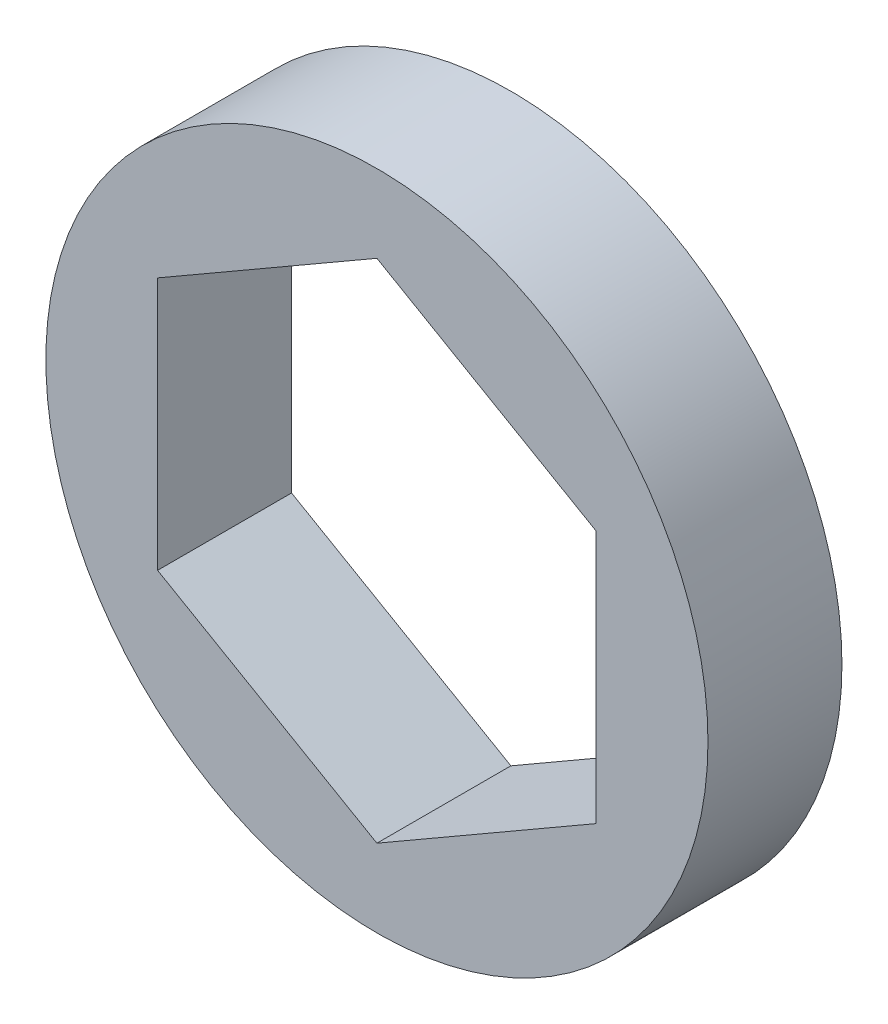
ISO-10303-21;
HEADER;
FILE_DESCRIPTION(('STEP AP214'),'2;1');
FILE_NAME('part.step','',(''),(''),'','','');
FILE_SCHEMA(('AUTOMOTIVE_DESIGN { 1 0 10303 214 1 1 1 1 }'));
ENDSEC;
DATA;
#1=APPLICATION_CONTEXT('core data for automotive mechanical design processes');
#2=APPLICATION_PROTOCOL_DEFINITION('international standard','automotive_design',2000,#1);
#3=PRODUCT_CONTEXT('',#1,'mechanical');
#4=PRODUCT('Part','Part','',(#3));
#5=PRODUCT_RELATED_PRODUCT_CATEGORY('part','',(#4));
#6=PRODUCT_DEFINITION_FORMATION('','',#4);
#7=PRODUCT_DEFINITION_CONTEXT('part definition',#1,'design');
#8=PRODUCT_DEFINITION('design','',#6,#7);
#9=PRODUCT_DEFINITION_SHAPE('','',#8);
#10=(LENGTH_UNIT() NAMED_UNIT(*) SI_UNIT(.MILLI.,.METRE.));
#11=(NAMED_UNIT(*) PLANE_ANGLE_UNIT() SI_UNIT($,.RADIAN.));
#12=(NAMED_UNIT(*) SI_UNIT($,.STERADIAN.) SOLID_ANGLE_UNIT());
#13=UNCERTAINTY_MEASURE_WITH_UNIT(LENGTH_MEASURE(1.E-05),#10,'distance_accuracy_value','');
#14=(GEOMETRIC_REPRESENTATION_CONTEXT(3) GLOBAL_UNCERTAINTY_ASSIGNED_CONTEXT((#13)) GLOBAL_UNIT_ASSIGNED_CONTEXT((#10,
#11,#12)) REPRESENTATION_CONTEXT('',''));
#15=CARTESIAN_POINT('',(0.,0.,0.));
#16=DIRECTION('',(0.,0.,1.));
#17=DIRECTION('',(1.,0.,0.));
#18=AXIS2_PLACEMENT_3D('',#15,#16,#17);
#19=CARTESIAN_POINT('',(0.,0.,4.111999904));
#20=DIRECTION('',(0.,0.,1.));
#21=DIRECTION('',(1.,0.,0.));
#22=AXIS2_PLACEMENT_3D('',#19,#20,#21);
#23=PLANE('',#22);
#24=CARTESIAN_POINT('',(0.,0.,4.111999904));
#25=DIRECTION('',(0.,0.,1.));
#26=DIRECTION('',(1.,0.,0.));
#27=AXIS2_PLACEMENT_3D('',#24,#25,#26);
#28=CIRCLE('',#27,10.16);
#29=CARTESIAN_POINT('',(10.16,0.,4.111999904));
#30=VERTEX_POINT('',#29);
#31=EDGE_CURVE('E11',#30,#30,#28,.T.);
#32=ORIENTED_EDGE('',*,*,#31,.T.);
#33=EDGE_LOOP('',(#32));
#34=FACE_BOUND('',#33,.T.);
#35=DIRECTION('',(-0.866025403784439,0.5,0.));
#36=VECTOR('',#35,1.);
#37=CARTESIAN_POINT('',(6.731,3.88614466191537,4.111999904));
#38=LINE('',#37,#36);
#39=CARTESIAN_POINT('',(6.731,3.88614466191537,4.111999904));
#40=VERTEX_POINT('',#39);
#41=CARTESIAN_POINT('',(0.,7.77228932383074,4.111999904));
#42=VERTEX_POINT('',#41);
#43=EDGE_CURVE('E100',#40,#42,#38,.T.);
#44=ORIENTED_EDGE('',*,*,#43,.F.);
#45=DIRECTION('',(0.,1.,0.));
#46=VECTOR('',#45,1.);
#47=CARTESIAN_POINT('',(6.731,-3.88614466191537,4.111999904));
#48=LINE('',#47,#46);
#49=CARTESIAN_POINT('',(6.731,-3.88614466191537,4.111999904));
#50=VERTEX_POINT('',#49);
#51=EDGE_CURVE('E92',#50,#40,#48,.T.);
#52=ORIENTED_EDGE('',*,*,#51,.F.);
#53=DIRECTION('',(0.866025403784439,0.5,0.));
#54=VECTOR('',#53,1.);
#55=CARTESIAN_POINT('',(0.,-7.77228932383074,4.111999904));
#56=LINE('',#55,#54);
#57=CARTESIAN_POINT('',(0.,-7.77228932383074,4.111999904));
#58=VERTEX_POINT('',#57);
#59=EDGE_CURVE('E120',#58,#50,#56,.T.);
#60=ORIENTED_EDGE('',*,*,#59,.F.);
#61=DIRECTION('',(0.866025403784439,-0.5,0.));
#62=VECTOR('',#61,1.);
#63=CARTESIAN_POINT('',(-6.731,-3.88614466191537,4.111999904));
#64=LINE('',#63,#62);
#65=CARTESIAN_POINT('',(-6.731,-3.88614466191537,4.111999904));
#66=VERTEX_POINT('',#65);
#67=EDGE_CURVE('E118',#66,#58,#64,.T.);
#68=ORIENTED_EDGE('',*,*,#67,.F.);
#69=DIRECTION('',(0.,-1.,0.));
#70=VECTOR('',#69,1.);
#71=CARTESIAN_POINT('',(-6.731,3.88614466191537,4.111999904));
#72=LINE('',#71,#70);
#73=CARTESIAN_POINT('',(-6.731,3.88614466191537,4.111999904));
#74=VERTEX_POINT('',#73);
#75=EDGE_CURVE('E114',#74,#66,#72,.T.);
#76=ORIENTED_EDGE('',*,*,#75,.F.);
#77=DIRECTION('',(-0.866025403784439,-0.5,0.));
#78=VECTOR('',#77,1.);
#79=CARTESIAN_POINT('',(0.,7.77228932383074,4.111999904));
#80=LINE('',#79,#78);
#81=EDGE_CURVE('E112',#42,#74,#80,.T.);
#82=ORIENTED_EDGE('',*,*,#81,.F.);
#83=EDGE_LOOP('',(#44,#52,#60,#68,#76,#82));
#84=FACE_BOUND('',#83,.T.);
#85=ADVANCED_FACE('F39',(#34,#84),#23,.T.);
#86=CARTESIAN_POINT('',(0.,0.,0.));
#87=DIRECTION('',(0.,0.,1.));
#88=DIRECTION('',(1.,0.,0.));
#89=AXIS2_PLACEMENT_3D('',#86,#87,#88);
#90=PLANE('',#89);
#91=CARTESIAN_POINT('',(0.,0.,0.));
#92=DIRECTION('',(0.,0.,1.));
#93=DIRECTION('',(1.,0.,0.));
#94=AXIS2_PLACEMENT_3D('',#91,#92,#93);
#95=CIRCLE('',#94,10.16);
#96=CARTESIAN_POINT('',(10.16,0.,0.));
#97=VERTEX_POINT('',#96);
#98=EDGE_CURVE('E43',#97,#97,#95,.T.);
#99=ORIENTED_EDGE('',*,*,#98,.F.);
#100=EDGE_LOOP('',(#99));
#101=FACE_BOUND('',#100,.T.);
#102=DIRECTION('',(0.,1.,0.));
#103=VECTOR('',#102,1.);
#104=CARTESIAN_POINT('',(6.731,-3.88614466191537,0.));
#105=LINE('',#104,#103);
#106=CARTESIAN_POINT('',(6.731,-3.88614466191537,0.));
#107=VERTEX_POINT('',#106);
#108=CARTESIAN_POINT('',(6.731,3.88614466191537,0.));
#109=VERTEX_POINT('',#108);
#110=EDGE_CURVE('E62',#107,#109,#105,.T.);
#111=ORIENTED_EDGE('',*,*,#110,.T.);
#112=DIRECTION('',(-0.866025403784439,0.5,0.));
#113=VECTOR('',#112,1.);
#114=CARTESIAN_POINT('',(6.731,3.88614466191537,0.));
#115=LINE('',#114,#113);
#116=CARTESIAN_POINT('',(0.,7.77228932383074,0.));
#117=VERTEX_POINT('',#116);
#118=EDGE_CURVE('E107',#109,#117,#115,.T.);
#119=ORIENTED_EDGE('',*,*,#118,.T.);
#120=DIRECTION('',(-0.866025403784439,-0.5,0.));
#121=VECTOR('',#120,1.);
#122=CARTESIAN_POINT('',(0.,7.77228932383074,0.));
#123=LINE('',#122,#121);
#124=CARTESIAN_POINT('',(-6.731,3.88614466191537,0.));
#125=VERTEX_POINT('',#124);
#126=EDGE_CURVE('E124',#117,#125,#123,.T.);
#127=ORIENTED_EDGE('',*,*,#126,.T.);
#128=DIRECTION('',(0.,-1.,0.));
#129=VECTOR('',#128,1.);
#130=CARTESIAN_POINT('',(-6.731,3.88614466191537,0.));
#131=LINE('',#130,#129);
#132=CARTESIAN_POINT('',(-6.731,-3.88614466191537,0.));
#133=VERTEX_POINT('',#132);
#134=EDGE_CURVE('E127',#125,#133,#131,.T.);
#135=ORIENTED_EDGE('',*,*,#134,.T.);
#136=DIRECTION('',(0.866025403784439,-0.5,0.));
#137=VECTOR('',#136,1.);
#138=CARTESIAN_POINT('',(-6.731,-3.88614466191537,0.));
#139=LINE('',#138,#137);
#140=CARTESIAN_POINT('',(0.,-7.77228932383074,0.));
#141=VERTEX_POINT('',#140);
#142=EDGE_CURVE('E130',#133,#141,#139,.T.);
#143=ORIENTED_EDGE('',*,*,#142,.T.);
#144=DIRECTION('',(0.866025403784439,0.5,0.));
#145=VECTOR('',#144,1.);
#146=CARTESIAN_POINT('',(0.,-7.77228932383074,0.));
#147=LINE('',#146,#145);
#148=EDGE_CURVE('E101',#141,#107,#147,.T.);
#149=ORIENTED_EDGE('',*,*,#148,.T.);
#150=EDGE_LOOP('',(#111,#119,#127,#135,#143,#149));
#151=FACE_BOUND('',#150,.T.);
#152=ADVANCED_FACE('F147',(#101,#151),#90,.F.);
#153=CARTESIAN_POINT('',(0.,0.,4.111999904));
#154=DIRECTION('',(0.,0.,-1.));
#155=DIRECTION('',(-1.,0.,0.));
#156=AXIS2_PLACEMENT_3D('',#153,#154,#155);
#157=CYLINDRICAL_SURFACE('',#156,10.16);
#158=ORIENTED_EDGE('',*,*,#31,.F.);
#159=EDGE_LOOP('',(#158));
#160=FACE_BOUND('',#159,.T.);
#161=ORIENTED_EDGE('',*,*,#98,.T.);
#162=EDGE_LOOP('',(#161));
#163=FACE_BOUND('',#162,.T.);
#164=ADVANCED_FACE('F41',(#160,#163),#157,.T.);
#165=CARTESIAN_POINT('',(6.731,-3.88614466191537,4.111999904));
#166=DIRECTION('',(-1.,0.,0.));
#167=DIRECTION('',(0.,-1.,0.));
#168=AXIS2_PLACEMENT_3D('',#165,#166,#167);
#169=PLANE('',#168);
#170=ORIENTED_EDGE('',*,*,#110,.F.);
#171=DIRECTION('',(0.,0.,-1.));
#172=VECTOR('',#171,1.);
#173=CARTESIAN_POINT('',(6.731,-3.88614466191537,4.111999904));
#174=LINE('',#173,#172);
#175=EDGE_CURVE('E96',#50,#107,#174,.T.);
#176=ORIENTED_EDGE('',*,*,#175,.F.);
#177=ORIENTED_EDGE('',*,*,#51,.T.);
#178=DIRECTION('',(0.,0.,-1.));
#179=VECTOR('',#178,1.);
#180=CARTESIAN_POINT('',(6.731,3.88614466191537,4.111999904));
#181=LINE('',#180,#179);
#182=EDGE_CURVE('E95',#40,#109,#181,.T.);
#183=ORIENTED_EDGE('',*,*,#182,.T.);
#184=EDGE_LOOP('',(#170,#176,#177,#183));
#185=FACE_BOUND('',#184,.T.);
#186=ADVANCED_FACE('F94',(#185),#169,.T.);
#187=CARTESIAN_POINT('',(6.731,3.88614466191537,4.111999904));
#188=DIRECTION('',(-0.5,-0.866025403784439,0.));
#189=DIRECTION('',(0.866025403784439,-0.5,0.));
#190=AXIS2_PLACEMENT_3D('',#187,#188,#189);
#191=PLANE('',#190);
#192=ORIENTED_EDGE('',*,*,#118,.F.);
#193=ORIENTED_EDGE('',*,*,#182,.F.);
#194=ORIENTED_EDGE('',*,*,#43,.T.);
#195=DIRECTION('',(0.,0.,-1.));
#196=VECTOR('',#195,1.);
#197=CARTESIAN_POINT('',(0.,7.77228932383074,4.111999904));
#198=LINE('',#197,#196);
#199=EDGE_CURVE('E108',#42,#117,#198,.T.);
#200=ORIENTED_EDGE('',*,*,#199,.T.);
#201=EDGE_LOOP('',(#192,#193,#194,#200));
#202=FACE_BOUND('',#201,.T.);
#203=ADVANCED_FACE('F104',(#202),#191,.T.);
#204=CARTESIAN_POINT('',(0.,7.77228932383074,4.111999904));
#205=DIRECTION('',(0.5,-0.866025403784439,0.));
#206=DIRECTION('',(0.866025403784439,0.5,0.));
#207=AXIS2_PLACEMENT_3D('',#204,#205,#206);
#208=PLANE('',#207);
#209=ORIENTED_EDGE('',*,*,#126,.F.);
#210=ORIENTED_EDGE('',*,*,#199,.F.);
#211=ORIENTED_EDGE('',*,*,#81,.T.);
#212=DIRECTION('',(0.,0.,-1.));
#213=VECTOR('',#212,1.);
#214=CARTESIAN_POINT('',(-6.731,3.88614466191537,4.111999904));
#215=LINE('',#214,#213);
#216=EDGE_CURVE('E139',#74,#125,#215,.T.);
#217=ORIENTED_EDGE('',*,*,#216,.T.);
#218=EDGE_LOOP('',(#209,#210,#211,#217));
#219=FACE_BOUND('',#218,.T.);
#220=ADVANCED_FACE('F143',(#219),#208,.T.);
#221=CARTESIAN_POINT('',(-6.731,3.88614466191537,4.111999904));
#222=DIRECTION('',(1.,0.,0.));
#223=DIRECTION('',(0.,1.,0.));
#224=AXIS2_PLACEMENT_3D('',#221,#222,#223);
#225=PLANE('',#224);
#226=ORIENTED_EDGE('',*,*,#134,.F.);
#227=ORIENTED_EDGE('',*,*,#216,.F.);
#228=ORIENTED_EDGE('',*,*,#75,.T.);
#229=DIRECTION('',(0.,0.,-1.));
#230=VECTOR('',#229,1.);
#231=CARTESIAN_POINT('',(-6.731,-3.88614466191537,4.111999904));
#232=LINE('',#231,#230);
#233=EDGE_CURVE('E137',#66,#133,#232,.T.);
#234=ORIENTED_EDGE('',*,*,#233,.T.);
#235=EDGE_LOOP('',(#226,#227,#228,#234));
#236=FACE_BOUND('',#235,.T.);
#237=ADVANCED_FACE('F155',(#236),#225,.T.);
#238=CARTESIAN_POINT('',(-6.731,-3.88614466191537,4.111999904));
#239=DIRECTION('',(0.5,0.866025403784439,0.));
#240=DIRECTION('',(-0.866025403784439,0.5,0.));
#241=AXIS2_PLACEMENT_3D('',#238,#239,#240);
#242=PLANE('',#241);
#243=ORIENTED_EDGE('',*,*,#142,.F.);
#244=ORIENTED_EDGE('',*,*,#233,.F.);
#245=ORIENTED_EDGE('',*,*,#67,.T.);
#246=DIRECTION('',(0.,0.,-1.));
#247=VECTOR('',#246,1.);
#248=CARTESIAN_POINT('',(0.,-7.77228932383074,4.111999904));
#249=LINE('',#248,#247);
#250=EDGE_CURVE('E54',#58,#141,#249,.T.);
#251=ORIENTED_EDGE('',*,*,#250,.T.);
#252=EDGE_LOOP('',(#243,#244,#245,#251));
#253=FACE_BOUND('',#252,.T.);
#254=ADVANCED_FACE('F153',(#253),#242,.T.);
#255=CARTESIAN_POINT('',(0.,-7.77228932383074,4.111999904));
#256=DIRECTION('',(-0.5,0.866025403784439,0.));
#257=DIRECTION('',(-0.866025403784439,-0.5,0.));
#258=AXIS2_PLACEMENT_3D('',#255,#256,#257);
#259=PLANE('',#258);
#260=ORIENTED_EDGE('',*,*,#148,.F.);
#261=ORIENTED_EDGE('',*,*,#250,.F.);
#262=ORIENTED_EDGE('',*,*,#59,.T.);
#263=ORIENTED_EDGE('',*,*,#175,.T.);
#264=EDGE_LOOP('',(#260,#261,#262,#263));
#265=FACE_BOUND('',#264,.T.);
#266=ADVANCED_FACE('F149',(#265),#259,.T.);
#267=CLOSED_SHELL('',(#85,#152,#164,#186,#203,#220,#237,#254,#266));
#268=MANIFOLD_SOLID_BREP('B2',#267);
#269=ADVANCED_BREP_SHAPE_REPRESENTATION('',(#18,#268),#14);
#270=SHAPE_DEFINITION_REPRESENTATION(#9,#269);
ENDSEC;
END-ISO-10303-21;
